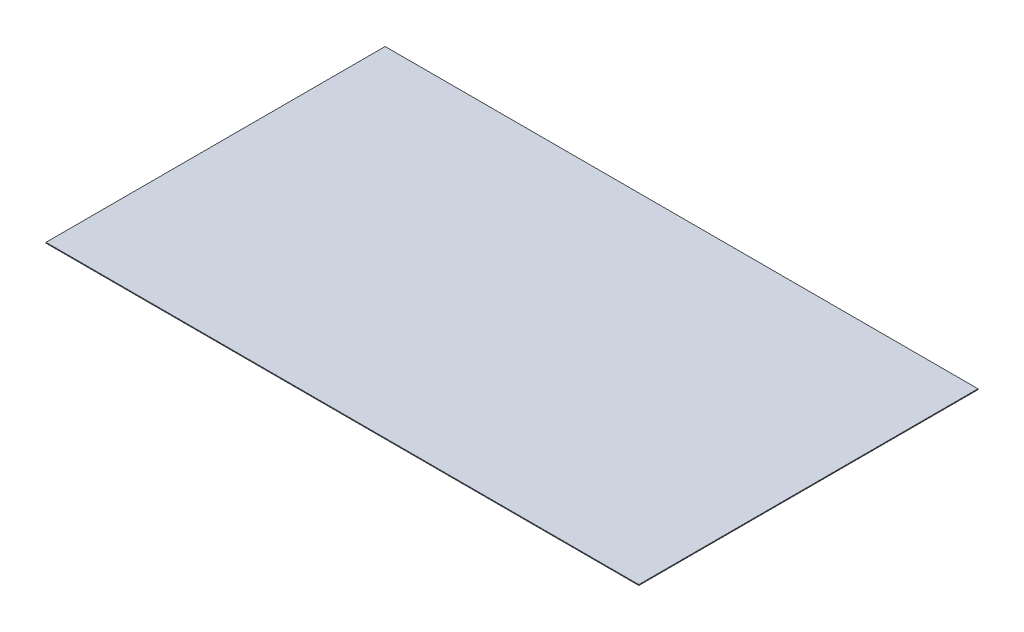
ISO-10303-21;
HEADER;
FILE_DESCRIPTION(('STEP AP214'),'2;1');
FILE_NAME('part.step','',(''),(''),'','','');
FILE_SCHEMA(('AUTOMOTIVE_DESIGN { 1 0 10303 214 1 1 1 1 }'));
ENDSEC;
DATA;
#1=APPLICATION_CONTEXT('core data for automotive mechanical design processes');
#2=APPLICATION_PROTOCOL_DEFINITION('international standard','automotive_design',2000,#1);
#3=PRODUCT_CONTEXT('',#1,'mechanical');
#4=PRODUCT('Part','Part','',(#3));
#5=PRODUCT_RELATED_PRODUCT_CATEGORY('part','',(#4));
#6=PRODUCT_DEFINITION_FORMATION('','',#4);
#7=PRODUCT_DEFINITION_CONTEXT('part definition',#1,'design');
#8=PRODUCT_DEFINITION('design','',#6,#7);
#9=PRODUCT_DEFINITION_SHAPE('','',#8);
#10=(LENGTH_UNIT() NAMED_UNIT(*) SI_UNIT(.MILLI.,.METRE.));
#11=(NAMED_UNIT(*) PLANE_ANGLE_UNIT() SI_UNIT($,.RADIAN.));
#12=(NAMED_UNIT(*) SI_UNIT($,.STERADIAN.) SOLID_ANGLE_UNIT());
#13=UNCERTAINTY_MEASURE_WITH_UNIT(LENGTH_MEASURE(1.E-05),#10,'distance_accuracy_value','');
#14=(GEOMETRIC_REPRESENTATION_CONTEXT(3) GLOBAL_UNCERTAINTY_ASSIGNED_CONTEXT((#13)) GLOBAL_UNIT_ASSIGNED_CONTEXT((#10,
#11,#12)) REPRESENTATION_CONTEXT('',''));
#15=CARTESIAN_POINT('',(0.,0.,0.));
#16=DIRECTION('',(0.,0.,1.));
#17=DIRECTION('',(1.,0.,0.));
#18=AXIS2_PLACEMENT_3D('',#15,#16,#17);
#19=CARTESIAN_POINT('',(1849.3982165725,5.,1057.97735033406));
#20=DIRECTION('',(-1.,0.,0.));
#21=DIRECTION('',(0.,0.,1.));
#22=AXIS2_PLACEMENT_3D('',#19,#20,#21);
#23=PLANE('',#22);
#24=DIRECTION('',(0.,0.,-1.));
#25=VECTOR('',#24,1.);
#26=CARTESIAN_POINT('',(1849.3982165725,0.,1057.97735033406));
#27=LINE('',#26,#25);
#28=CARTESIAN_POINT('',(1849.3982165725,0.,1057.97735033406));
#29=VERTEX_POINT('',#28);
#30=CARTESIAN_POINT('',(1849.3982165725,0.,-1057.97735033406));
#31=VERTEX_POINT('',#30);
#32=EDGE_CURVE('E104',#29,#31,#27,.T.);
#33=ORIENTED_EDGE('',*,*,#32,.T.);
#34=DIRECTION('',(0.,-1.,0.));
#35=VECTOR('',#34,1.);
#36=CARTESIAN_POINT('',(1849.3982165725,5.,-1057.97735033406));
#37=LINE('',#36,#35);
#38=CARTESIAN_POINT('',(1849.3982165725,5.,-1057.97735033406));
#39=VERTEX_POINT('',#38);
#40=EDGE_CURVE('E11',#39,#31,#37,.T.);
#41=ORIENTED_EDGE('',*,*,#40,.F.);
#42=DIRECTION('',(0.,0.,-1.));
#43=VECTOR('',#42,1.);
#44=CARTESIAN_POINT('',(1849.3982165725,5.,1057.97735033406));
#45=LINE('',#44,#43);
#46=CARTESIAN_POINT('',(1849.3982165725,5.,1057.97735033406));
#47=VERTEX_POINT('',#46);
#48=EDGE_CURVE('E92',#47,#39,#45,.T.);
#49=ORIENTED_EDGE('',*,*,#48,.F.);
#50=DIRECTION('',(0.,-1.,0.));
#51=VECTOR('',#50,1.);
#52=CARTESIAN_POINT('',(1849.3982165725,5.,1057.97735033406));
#53=LINE('',#52,#51);
#54=EDGE_CURVE('E100',#47,#29,#53,.T.);
#55=ORIENTED_EDGE('',*,*,#54,.T.);
#56=EDGE_LOOP('',(#33,#41,#49,#55));
#57=FACE_BOUND('',#56,.T.);
#58=ADVANCED_FACE('F41',(#57),#23,.F.);
#59=CARTESIAN_POINT('',(-1849.3982165725,5.,-1057.97735033406));
#60=DIRECTION('',(0.,0.,1.));
#61=DIRECTION('',(1.,0.,0.));
#62=AXIS2_PLACEMENT_3D('',#59,#60,#61);
#63=PLANE('',#62);
#64=DIRECTION('',(-1.,0.,0.));
#65=VECTOR('',#64,1.);
#66=CARTESIAN_POINT('',(-1849.3982165725,0.,-1057.97735033406));
#67=LINE('',#66,#65);
#68=CARTESIAN_POINT('',(-1849.3982165725,0.,-1057.97735033406));
#69=VERTEX_POINT('',#68);
#70=EDGE_CURVE('E96',#31,#69,#67,.T.);
#71=ORIENTED_EDGE('',*,*,#70,.T.);
#72=DIRECTION('',(0.,-1.,0.));
#73=VECTOR('',#72,1.);
#74=CARTESIAN_POINT('',(-1849.3982165725,5.,-1057.97735033406));
#75=LINE('',#74,#73);
#76=CARTESIAN_POINT('',(-1849.3982165725,5.,-1057.97735033406));
#77=VERTEX_POINT('',#76);
#78=EDGE_CURVE('E49',#77,#69,#75,.T.);
#79=ORIENTED_EDGE('',*,*,#78,.F.);
#80=DIRECTION('',(-1.,0.,0.));
#81=VECTOR('',#80,1.);
#82=CARTESIAN_POINT('',(-1849.3982165725,5.,-1057.97735033406));
#83=LINE('',#82,#81);
#84=EDGE_CURVE('E87',#39,#77,#83,.T.);
#85=ORIENTED_EDGE('',*,*,#84,.F.);
#86=ORIENTED_EDGE('',*,*,#40,.T.);
#87=EDGE_LOOP('',(#71,#79,#85,#86));
#88=FACE_BOUND('',#87,.T.);
#89=ADVANCED_FACE('F95',(#88),#63,.F.);
#90=CARTESIAN_POINT('',(-1849.3982165725,5.,1057.97735033406));
#91=DIRECTION('',(1.,0.,0.));
#92=DIRECTION('',(0.,0.,-1.));
#93=AXIS2_PLACEMENT_3D('',#90,#91,#92);
#94=PLANE('',#93);
#95=DIRECTION('',(0.,0.,1.));
#96=VECTOR('',#95,1.);
#97=CARTESIAN_POINT('',(-1849.3982165725,0.,1057.97735033406));
#98=LINE('',#97,#96);
#99=CARTESIAN_POINT('',(-1849.3982165725,0.,1057.97735033406));
#100=VERTEX_POINT('',#99);
#101=EDGE_CURVE('E74',#69,#100,#98,.T.);
#102=ORIENTED_EDGE('',*,*,#101,.T.);
#103=DIRECTION('',(0.,-1.,0.));
#104=VECTOR('',#103,1.);
#105=CARTESIAN_POINT('',(-1849.3982165725,5.,1057.97735033406));
#106=LINE('',#105,#104);
#107=CARTESIAN_POINT('',(-1849.3982165725,5.,1057.97735033406));
#108=VERTEX_POINT('',#107);
#109=EDGE_CURVE('E97',#108,#100,#106,.T.);
#110=ORIENTED_EDGE('',*,*,#109,.F.);
#111=DIRECTION('',(0.,0.,1.));
#112=VECTOR('',#111,1.);
#113=CARTESIAN_POINT('',(-1849.3982165725,5.,1057.97735033406));
#114=LINE('',#113,#112);
#115=EDGE_CURVE('E90',#77,#108,#114,.T.);
#116=ORIENTED_EDGE('',*,*,#115,.F.);
#117=ORIENTED_EDGE('',*,*,#78,.T.);
#118=EDGE_LOOP('',(#102,#110,#116,#117));
#119=FACE_BOUND('',#118,.T.);
#120=ADVANCED_FACE('F98',(#119),#94,.F.);
#121=CARTESIAN_POINT('',(-1849.3982165725,5.,1057.97735033406));
#122=DIRECTION('',(0.,0.,-1.));
#123=DIRECTION('',(-1.,0.,0.));
#124=AXIS2_PLACEMENT_3D('',#121,#122,#123);
#125=PLANE('',#124);
#126=DIRECTION('',(1.,0.,0.));
#127=VECTOR('',#126,1.);
#128=CARTESIAN_POINT('',(-1849.3982165725,0.,1057.97735033406));
#129=LINE('',#128,#127);
#130=EDGE_CURVE('E80',#100,#29,#129,.T.);
#131=ORIENTED_EDGE('',*,*,#130,.T.);
#132=ORIENTED_EDGE('',*,*,#54,.F.);
#133=DIRECTION('',(1.,0.,0.));
#134=VECTOR('',#133,1.);
#135=CARTESIAN_POINT('',(-1849.3982165725,5.,1057.97735033406));
#136=LINE('',#135,#134);
#137=EDGE_CURVE('E57',#108,#47,#136,.T.);
#138=ORIENTED_EDGE('',*,*,#137,.F.);
#139=ORIENTED_EDGE('',*,*,#109,.T.);
#140=EDGE_LOOP('',(#131,#132,#138,#139));
#141=FACE_BOUND('',#140,.T.);
#142=ADVANCED_FACE('F111',(#141),#125,.F.);
#143=CARTESIAN_POINT('',(0.,5.,0.));
#144=DIRECTION('',(0.,-1.,0.));
#145=DIRECTION('',(0.,0.,-1.));
#146=AXIS2_PLACEMENT_3D('',#143,#144,#145);
#147=PLANE('',#146);
#148=ORIENTED_EDGE('',*,*,#48,.T.);
#149=ORIENTED_EDGE('',*,*,#84,.T.);
#150=ORIENTED_EDGE('',*,*,#115,.T.);
#151=ORIENTED_EDGE('',*,*,#137,.T.);
#152=EDGE_LOOP('',(#148,#149,#150,#151));
#153=FACE_BOUND('',#152,.T.);
#154=ADVANCED_FACE('F88',(#153),#147,.F.);
#155=CARTESIAN_POINT('',(0.,0.,0.));
#156=DIRECTION('',(0.,-1.,0.));
#157=DIRECTION('',(0.,0.,-1.));
#158=AXIS2_PLACEMENT_3D('',#155,#156,#157);
#159=PLANE('',#158);
#160=ORIENTED_EDGE('',*,*,#32,.F.);
#161=ORIENTED_EDGE('',*,*,#130,.F.);
#162=ORIENTED_EDGE('',*,*,#101,.F.);
#163=ORIENTED_EDGE('',*,*,#70,.F.);
#164=EDGE_LOOP('',(#160,#161,#162,#163));
#165=FACE_BOUND('',#164,.T.);
#166=ADVANCED_FACE('F114',(#165),#159,.T.);
#167=CLOSED_SHELL('',(#58,#89,#120,#142,#154,#166));
#168=MANIFOLD_SOLID_BREP('B2',#167);
#169=ADVANCED_BREP_SHAPE_REPRESENTATION('',(#18,#168),#14);
#170=SHAPE_DEFINITION_REPRESENTATION(#9,#169);
ENDSEC;
END-ISO-10303-21;
